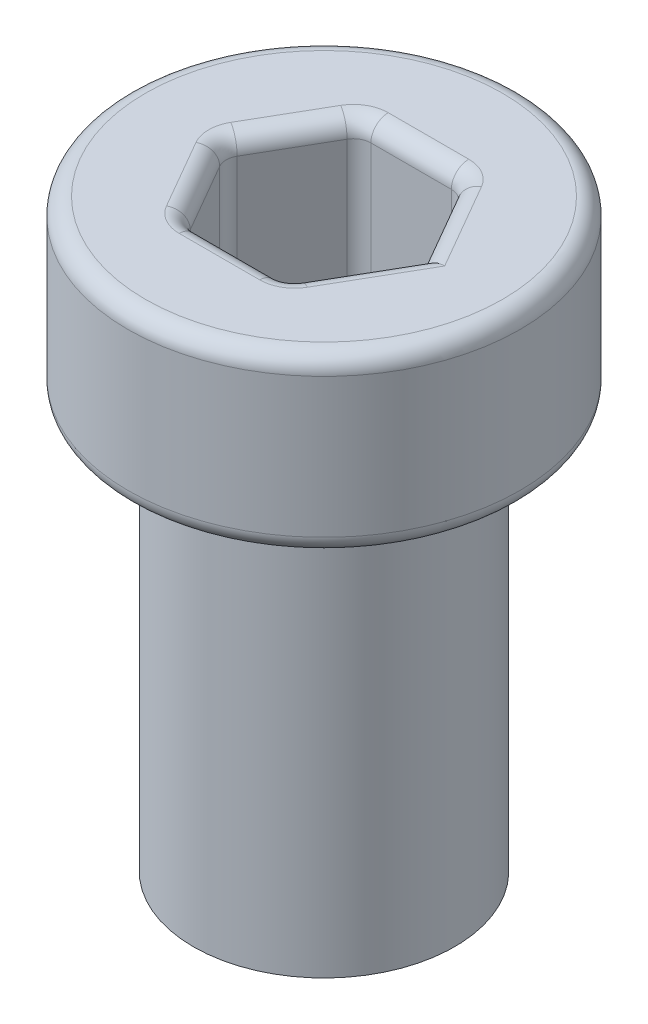
ISO-10303-21;
HEADER;
FILE_DESCRIPTION(('STEP AP214'),'2;1');
FILE_NAME('part.step','',(''),(''),'','','');
FILE_SCHEMA(('AUTOMOTIVE_DESIGN { 1 0 10303 214 1 1 1 1 }'));
ENDSEC;
DATA;
#1=APPLICATION_CONTEXT('core data for automotive mechanical design processes');
#2=APPLICATION_PROTOCOL_DEFINITION('international standard','automotive_design',2000,#1);
#3=PRODUCT_CONTEXT('',#1,'mechanical');
#4=PRODUCT('Part','Part','',(#3));
#5=PRODUCT_RELATED_PRODUCT_CATEGORY('part','',(#4));
#6=PRODUCT_DEFINITION_FORMATION('','',#4);
#7=PRODUCT_DEFINITION_CONTEXT('part definition',#1,'design');
#8=PRODUCT_DEFINITION('design','',#6,#7);
#9=PRODUCT_DEFINITION_SHAPE('','',#8);
#10=(LENGTH_UNIT() NAMED_UNIT(*) SI_UNIT(.MILLI.,.METRE.));
#11=(NAMED_UNIT(*) PLANE_ANGLE_UNIT() SI_UNIT($,.RADIAN.));
#12=(NAMED_UNIT(*) SI_UNIT($,.STERADIAN.) SOLID_ANGLE_UNIT());
#13=UNCERTAINTY_MEASURE_WITH_UNIT(LENGTH_MEASURE(1.E-05),#10,'distance_accuracy_value','');
#14=(GEOMETRIC_REPRESENTATION_CONTEXT(3) GLOBAL_UNCERTAINTY_ASSIGNED_CONTEXT((#13)) GLOBAL_UNIT_ASSIGNED_CONTEXT((#10,
#11,#12)) REPRESENTATION_CONTEXT('',''));
#15=CARTESIAN_POINT('',(0.,0.,0.));
#16=DIRECTION('',(0.,0.,1.));
#17=DIRECTION('',(1.,0.,0.));
#18=AXIS2_PLACEMENT_3D('',#15,#16,#17);
#19=CARTESIAN_POINT('',(0.,2.,0.));
#20=DIRECTION('',(0.,1.,0.));
#21=DIRECTION('',(0.,0.,1.));
#22=AXIS2_PLACEMENT_3D('',#19,#20,#21);
#23=PLANE('',#22);
#24=CARTESIAN_POINT('',(0.,2.,0.));
#25=DIRECTION('',(0.,1.,0.));
#26=DIRECTION('',(0.,0.,1.));
#27=AXIS2_PLACEMENT_3D('',#24,#25,#26);
#28=CIRCLE('',#27,2.05);
#29=CARTESIAN_POINT('',(0.,2.,2.05));
#30=VERTEX_POINT('',#29);
#31=EDGE_CURVE('E277',#30,#30,#28,.T.);
#32=ORIENTED_EDGE('',*,*,#31,.T.);
#33=EDGE_LOOP('',(#32));
#34=FACE_BOUND('',#33,.T.);
#35=CARTESIAN_POINT('',(0.4618802153517,2.,-0.8));
#36=DIRECTION('',(0.,1.,0.));
#37=DIRECTION('',(0.,0.,1.));
#38=AXIS2_PLACEMENT_3D('',#35,#36,#37);
#39=CIRCLE('',#38,0.4);
#40=CARTESIAN_POINT('',(0.808290376865476,2.,-1.));
#41=VERTEX_POINT('',#40);
#42=CARTESIAN_POINT('',(0.4618802153517,2.,-1.2));
#43=VERTEX_POINT('',#42);
#44=EDGE_CURVE('E58',#41,#43,#39,.T.);
#45=ORIENTED_EDGE('',*,*,#44,.F.);
#46=DIRECTION('',(-0.5,0.,-0.866025403784439));
#47=VECTOR('',#46,1.);
#48=CARTESIAN_POINT('',(1.03923048454133,2.,-0.6));
#49=LINE('',#48,#47);
#50=CARTESIAN_POINT('',(1.3856406460551,2.,0.));
#51=VERTEX_POINT('',#50);
#52=EDGE_CURVE('E302',#41,#51,#49,.F.);
#53=ORIENTED_EDGE('',*,*,#52,.T.);
#54=DIRECTION('',(0.5,0.,-0.866025403784439));
#55=VECTOR('',#54,1.);
#56=CARTESIAN_POINT('',(1.03923048454133,2.,0.6));
#57=LINE('',#56,#55);
#58=CARTESIAN_POINT('',(0.808290376865476,2.,1.));
#59=VERTEX_POINT('',#58);
#60=EDGE_CURVE('E300',#51,#59,#57,.F.);
#61=ORIENTED_EDGE('',*,*,#60,.T.);
#62=CARTESIAN_POINT('',(0.461880215351701,2.,0.8));
#63=DIRECTION('',(0.,1.,0.));
#64=DIRECTION('',(0.,0.,1.));
#65=AXIS2_PLACEMENT_3D('',#62,#63,#64);
#66=CIRCLE('',#65,0.4);
#67=CARTESIAN_POINT('',(0.461880215351701,2.,1.2));
#68=VERTEX_POINT('',#67);
#69=EDGE_CURVE('E297',#68,#59,#66,.T.);
#70=ORIENTED_EDGE('',*,*,#69,.F.);
#71=DIRECTION('',(1.,0.,0.));
#72=VECTOR('',#71,1.);
#73=CARTESIAN_POINT('',(0.,2.,1.2));
#74=LINE('',#73,#72);
#75=CARTESIAN_POINT('',(-0.4618802153517,2.,1.2));
#76=VERTEX_POINT('',#75);
#77=EDGE_CURVE('E293',#68,#76,#74,.F.);
#78=ORIENTED_EDGE('',*,*,#77,.T.);
#79=CARTESIAN_POINT('',(-0.4618802153517,2.,0.8));
#80=DIRECTION('',(0.,1.,0.));
#81=DIRECTION('',(0.,0.,1.));
#82=AXIS2_PLACEMENT_3D('',#79,#80,#81);
#83=CIRCLE('',#82,0.4);
#84=CARTESIAN_POINT('',(-0.808290376865476,2.,1.));
#85=VERTEX_POINT('',#84);
#86=EDGE_CURVE('E290',#85,#76,#83,.T.);
#87=ORIENTED_EDGE('',*,*,#86,.F.);
#88=DIRECTION('',(0.5,0.,0.866025403784438));
#89=VECTOR('',#88,1.);
#90=CARTESIAN_POINT('',(-1.03923048454133,2.,0.6));
#91=LINE('',#90,#89);
#92=CARTESIAN_POINT('',(-1.27017059221718,2.,0.2));
#93=VERTEX_POINT('',#92);
#94=EDGE_CURVE('E288',#85,#93,#91,.F.);
#95=ORIENTED_EDGE('',*,*,#94,.T.);
#96=CARTESIAN_POINT('',(-0.923760430703401,2.,0.));
#97=DIRECTION('',(0.,1.,0.));
#98=DIRECTION('',(0.,0.,1.));
#99=AXIS2_PLACEMENT_3D('',#96,#97,#98);
#100=CIRCLE('',#99,0.4);
#101=CARTESIAN_POINT('',(-1.27017059221718,2.,-0.199999999999999));
#102=VERTEX_POINT('',#101);
#103=EDGE_CURVE('E285',#102,#93,#100,.T.);
#104=ORIENTED_EDGE('',*,*,#103,.F.);
#105=DIRECTION('',(-0.5,0.,0.866025403784439));
#106=VECTOR('',#105,1.);
#107=CARTESIAN_POINT('',(-1.03923048454133,2.,-0.599999999999999));
#108=LINE('',#107,#106);
#109=CARTESIAN_POINT('',(-0.808290376865476,2.,-1.));
#110=VERTEX_POINT('',#109);
#111=EDGE_CURVE('E283',#102,#110,#108,.F.);
#112=ORIENTED_EDGE('',*,*,#111,.T.);
#113=CARTESIAN_POINT('',(-0.461880215351701,2.,-0.8));
#114=DIRECTION('',(0.,1.,0.));
#115=DIRECTION('',(0.,0.,1.));
#116=AXIS2_PLACEMENT_3D('',#113,#114,#115);
#117=CIRCLE('',#116,0.4);
#118=CARTESIAN_POINT('',(-0.461880215351701,2.,-1.2));
#119=VERTEX_POINT('',#118);
#120=EDGE_CURVE('E280',#119,#110,#117,.T.);
#121=ORIENTED_EDGE('',*,*,#120,.F.);
#122=DIRECTION('',(-1.,0.,0.));
#123=VECTOR('',#122,1.);
#124=CARTESIAN_POINT('',(0.,2.,-1.2));
#125=LINE('',#124,#123);
#126=EDGE_CURVE('E295',#119,#43,#125,.F.);
#127=ORIENTED_EDGE('',*,*,#126,.T.);
#128=EDGE_LOOP('',(#45,#53,#61,#70,#78,#87,#95,#104,#112,#121,#127));
#129=FACE_BOUND('',#128,.T.);
#130=ADVANCED_FACE('F41',(#34,#129),#23,.T.);
#131=CARTESIAN_POINT('',(0.,0.,0.));
#132=DIRECTION('',(0.,1.,0.));
#133=DIRECTION('',(0.,0.,1.));
#134=AXIS2_PLACEMENT_3D('',#131,#132,#133);
#135=PLANE('',#134);
#136=CARTESIAN_POINT('',(0.,0.,0.));
#137=DIRECTION('',(0.,1.,0.));
#138=DIRECTION('',(0.,0.,1.));
#139=AXIS2_PLACEMENT_3D('',#136,#137,#138);
#140=CIRCLE('',#139,2.05);
#141=CARTESIAN_POINT('',(0.,0.,2.05));
#142=VERTEX_POINT('',#141);
#143=EDGE_CURVE('E11',#142,#142,#140,.F.);
#144=ORIENTED_EDGE('',*,*,#143,.T.);
#145=EDGE_LOOP('',(#144));
#146=FACE_BOUND('',#145,.T.);
#147=CARTESIAN_POINT('',(0.,0.,0.));
#148=DIRECTION('',(0.,1.,0.));
#149=DIRECTION('',(0.,0.,1.));
#150=AXIS2_PLACEMENT_3D('',#147,#148,#149);
#151=CIRCLE('',#150,1.5);
#152=CARTESIAN_POINT('',(0.,0.,1.5));
#153=VERTEX_POINT('',#152);
#154=EDGE_CURVE('E384',#153,#153,#151,.T.);
#155=ORIENTED_EDGE('',*,*,#154,.T.);
#156=EDGE_LOOP('',(#155));
#157=FACE_BOUND('',#156,.T.);
#158=ADVANCED_FACE('F419',(#146,#157),#135,.F.);
#159=CARTESIAN_POINT('',(0.,2.,0.));
#160=DIRECTION('',(0.,-1.,0.));
#161=DIRECTION('',(0.,0.,-1.));
#162=AXIS2_PLACEMENT_3D('',#159,#160,#161);
#163=CYLINDRICAL_SURFACE('',#162,2.25);
#164=CARTESIAN_POINT('',(0.,0.2,0.));
#165=DIRECTION('',(0.,1.,0.));
#166=DIRECTION('',(0.,0.,1.));
#167=AXIS2_PLACEMENT_3D('',#164,#165,#166);
#168=CIRCLE('',#167,2.25);
#169=CARTESIAN_POINT('',(0.,0.2,2.25));
#170=VERTEX_POINT('',#169);
#171=EDGE_CURVE('E50',#170,#170,#168,.T.);
#172=ORIENTED_EDGE('',*,*,#171,.T.);
#173=EDGE_LOOP('',(#172));
#174=FACE_BOUND('',#173,.T.);
#175=CARTESIAN_POINT('',(0.,1.8,0.));
#176=DIRECTION('',(0.,1.,0.));
#177=DIRECTION('',(0.,0.,1.));
#178=AXIS2_PLACEMENT_3D('',#175,#176,#177);
#179=CIRCLE('',#178,2.25);
#180=CARTESIAN_POINT('',(0.,1.8,2.25));
#181=VERTEX_POINT('',#180);
#182=EDGE_CURVE('E305',#181,#181,#179,.F.);
#183=ORIENTED_EDGE('',*,*,#182,.T.);
#184=EDGE_LOOP('',(#183));
#185=FACE_BOUND('',#184,.T.);
#186=ADVANCED_FACE('F425',(#174,#185),#163,.T.);
#187=CARTESIAN_POINT('',(0.577350269189626,2.,-1.));
#188=DIRECTION('',(0.,0.,1.));
#189=DIRECTION('',(1.,0.,0.));
#190=AXIS2_PLACEMENT_3D('',#187,#188,#189);
#191=PLANE('',#190);
#192=DIRECTION('',(0.,-1.,0.));
#193=VECTOR('',#192,1.);
#194=CARTESIAN_POINT('',(-0.461880215351701,0.,-1.));
#195=LINE('',#194,#193);
#196=CARTESIAN_POINT('',(-0.461880215351701,1.8,-1.));
#197=VERTEX_POINT('',#196);
#198=CARTESIAN_POINT('',(-0.461880215351701,0.2,-1.));
#199=VERTEX_POINT('',#198);
#200=EDGE_CURVE('E190',#197,#199,#195,.T.);
#201=ORIENTED_EDGE('',*,*,#200,.T.);
#202=DIRECTION('',(-1.,0.,0.));
#203=VECTOR('',#202,1.);
#204=CARTESIAN_POINT('',(0.577350269189626,0.2,-1.));
#205=LINE('',#204,#203);
#206=CARTESIAN_POINT('',(0.4618802153517,0.2,-1.));
#207=VERTEX_POINT('',#206);
#208=EDGE_CURVE('E186',#199,#207,#205,.F.);
#209=ORIENTED_EDGE('',*,*,#208,.T.);
#210=DIRECTION('',(0.,-1.,0.));
#211=VECTOR('',#210,1.);
#212=CARTESIAN_POINT('',(0.4618802153517,2.,-1.));
#213=LINE('',#212,#211);
#214=CARTESIAN_POINT('',(0.4618802153517,1.8,-1.));
#215=VERTEX_POINT('',#214);
#216=EDGE_CURVE('E178',#207,#215,#213,.F.);
#217=ORIENTED_EDGE('',*,*,#216,.T.);
#218=DIRECTION('',(-1.,0.,0.));
#219=VECTOR('',#218,1.);
#220=CARTESIAN_POINT('',(0.577350269189626,1.8,-1.));
#221=LINE('',#220,#219);
#222=EDGE_CURVE('E183',#215,#197,#221,.T.);
#223=ORIENTED_EDGE('',*,*,#222,.T.);
#224=EDGE_LOOP('',(#201,#209,#217,#223));
#225=FACE_BOUND('',#224,.T.);
#226=ADVANCED_FACE('F181',(#225),#191,.T.);
#227=CARTESIAN_POINT('',(-0.577350269189626,2.,-1.));
#228=DIRECTION('',(0.866025403784439,0.,0.5));
#229=DIRECTION('',(0.5,0.,-0.866025403784439));
#230=AXIS2_PLACEMENT_3D('',#227,#228,#229);
#231=PLANE('',#230);
#232=DIRECTION('',(0.,-1.,0.));
#233=VECTOR('',#232,1.);
#234=CARTESIAN_POINT('',(-1.09696551146029,0.,-0.0999999999999996));
#235=LINE('',#234,#233);
#236=CARTESIAN_POINT('',(-1.09696551146029,1.8,-0.0999999999999995));
#237=VERTEX_POINT('',#236);
#238=CARTESIAN_POINT('',(-1.09696551146029,0.2,-0.0999999999999996));
#239=VERTEX_POINT('',#238);
#240=EDGE_CURVE('E227',#237,#239,#235,.T.);
#241=ORIENTED_EDGE('',*,*,#240,.T.);
#242=DIRECTION('',(-0.5,0.,0.866025403784439));
#243=VECTOR('',#242,1.);
#244=CARTESIAN_POINT('',(-0.577350269189626,0.2,-1.));
#245=LINE('',#244,#243);
#246=CARTESIAN_POINT('',(-0.635085296108588,0.2,-0.9));
#247=VERTEX_POINT('',#246);
#248=EDGE_CURVE('E232',#239,#247,#245,.F.);
#249=ORIENTED_EDGE('',*,*,#248,.T.);
#250=DIRECTION('',(0.,-1.,0.));
#251=VECTOR('',#250,1.);
#252=CARTESIAN_POINT('',(-0.635085296108588,2.,-0.9));
#253=LINE('',#252,#251);
#254=CARTESIAN_POINT('',(-0.635085296108588,1.8,-0.9));
#255=VERTEX_POINT('',#254);
#256=EDGE_CURVE('E229',#247,#255,#253,.F.);
#257=ORIENTED_EDGE('',*,*,#256,.T.);
#258=DIRECTION('',(-0.5,0.,0.866025403784439));
#259=VECTOR('',#258,1.);
#260=CARTESIAN_POINT('',(-0.577350269189626,1.8,-1.));
#261=LINE('',#260,#259);
#262=EDGE_CURVE('E225',#255,#237,#261,.T.);
#263=ORIENTED_EDGE('',*,*,#262,.T.);
#264=EDGE_LOOP('',(#241,#249,#257,#263));
#265=FACE_BOUND('',#264,.T.);
#266=ADVANCED_FACE('F435',(#265),#231,.T.);
#267=CARTESIAN_POINT('',(-1.15470053837925,2.,0.));
#268=DIRECTION('',(0.866025403784439,0.,-0.5));
#269=DIRECTION('',(-0.5,0.,-0.866025403784438));
#270=AXIS2_PLACEMENT_3D('',#267,#268,#269);
#271=PLANE('',#270);
#272=DIRECTION('',(0.,-1.,0.));
#273=VECTOR('',#272,1.);
#274=CARTESIAN_POINT('',(-0.635085296108588,0.,0.9));
#275=LINE('',#274,#273);
#276=CARTESIAN_POINT('',(-0.635085296108588,1.8,0.9));
#277=VERTEX_POINT('',#276);
#278=CARTESIAN_POINT('',(-0.635085296108588,0.2,0.9));
#279=VERTEX_POINT('',#278);
#280=EDGE_CURVE('E236',#277,#279,#275,.T.);
#281=ORIENTED_EDGE('',*,*,#280,.T.);
#282=DIRECTION('',(0.5,0.,0.866025403784438));
#283=VECTOR('',#282,1.);
#284=CARTESIAN_POINT('',(-1.15470053837925,0.2,0.));
#285=LINE('',#284,#283);
#286=CARTESIAN_POINT('',(-1.09696551146029,0.2,0.1));
#287=VERTEX_POINT('',#286);
#288=EDGE_CURVE('E241',#279,#287,#285,.F.);
#289=ORIENTED_EDGE('',*,*,#288,.T.);
#290=DIRECTION('',(0.,-1.,0.));
#291=VECTOR('',#290,1.);
#292=CARTESIAN_POINT('',(-1.09696551146029,2.,0.1));
#293=LINE('',#292,#291);
#294=CARTESIAN_POINT('',(-1.09696551146029,1.8,0.1));
#295=VERTEX_POINT('',#294);
#296=EDGE_CURVE('E238',#287,#295,#293,.F.);
#297=ORIENTED_EDGE('',*,*,#296,.T.);
#298=DIRECTION('',(0.5,0.,0.866025403784438));
#299=VECTOR('',#298,1.);
#300=CARTESIAN_POINT('',(-1.15470053837925,1.8,0.));
#301=LINE('',#300,#299);
#302=EDGE_CURVE('E234',#295,#277,#301,.T.);
#303=ORIENTED_EDGE('',*,*,#302,.T.);
#304=EDGE_LOOP('',(#281,#289,#297,#303));
#305=FACE_BOUND('',#304,.T.);
#306=ADVANCED_FACE('F606',(#305),#271,.T.);
#307=CARTESIAN_POINT('',(-0.577350269189625,2.,1.));
#308=DIRECTION('',(0.,0.,-1.));
#309=DIRECTION('',(-1.,0.,0.));
#310=AXIS2_PLACEMENT_3D('',#307,#308,#309);
#311=PLANE('',#310);
#312=DIRECTION('',(0.,-1.,0.));
#313=VECTOR('',#312,1.);
#314=CARTESIAN_POINT('',(0.461880215351701,0.,1.));
#315=LINE('',#314,#313);
#316=CARTESIAN_POINT('',(0.461880215351701,1.8,1.));
#317=VERTEX_POINT('',#316);
#318=CARTESIAN_POINT('',(0.461880215351701,0.2,1.));
#319=VERTEX_POINT('',#318);
#320=EDGE_CURVE('E245',#317,#319,#315,.T.);
#321=ORIENTED_EDGE('',*,*,#320,.T.);
#322=DIRECTION('',(1.,0.,0.));
#323=VECTOR('',#322,1.);
#324=CARTESIAN_POINT('',(-0.577350269189625,0.2,1.));
#325=LINE('',#324,#323);
#326=CARTESIAN_POINT('',(-0.4618802153517,0.2,1.));
#327=VERTEX_POINT('',#326);
#328=EDGE_CURVE('E250',#319,#327,#325,.F.);
#329=ORIENTED_EDGE('',*,*,#328,.T.);
#330=DIRECTION('',(0.,-1.,0.));
#331=VECTOR('',#330,1.);
#332=CARTESIAN_POINT('',(-0.4618802153517,2.,1.));
#333=LINE('',#332,#331);
#334=CARTESIAN_POINT('',(-0.4618802153517,1.8,1.));
#335=VERTEX_POINT('',#334);
#336=EDGE_CURVE('E247',#327,#335,#333,.F.);
#337=ORIENTED_EDGE('',*,*,#336,.T.);
#338=DIRECTION('',(1.,0.,0.));
#339=VECTOR('',#338,1.);
#340=CARTESIAN_POINT('',(-0.577350269189625,1.8,1.));
#341=LINE('',#340,#339);
#342=EDGE_CURVE('E243',#335,#317,#341,.T.);
#343=ORIENTED_EDGE('',*,*,#342,.T.);
#344=EDGE_LOOP('',(#321,#329,#337,#343));
#345=FACE_BOUND('',#344,.T.);
#346=ADVANCED_FACE('F604',(#345),#311,.T.);
#347=CARTESIAN_POINT('',(0.577350269189626,2.,1.));
#348=DIRECTION('',(-0.866025403784439,0.,-0.5));
#349=DIRECTION('',(-0.5,0.,0.866025403784439));
#350=AXIS2_PLACEMENT_3D('',#347,#348,#349);
#351=PLANE('',#350);
#352=DIRECTION('',(0.,-1.,0.));
#353=VECTOR('',#352,1.);
#354=CARTESIAN_POINT('',(1.15470053837925,2.,0.));
#355=LINE('',#354,#353);
#356=CARTESIAN_POINT('',(1.15470053837925,1.8,0.));
#357=VERTEX_POINT('',#356);
#358=CARTESIAN_POINT('',(1.15470053837925,0.2,0.));
#359=VERTEX_POINT('',#358);
#360=EDGE_CURVE('E387',#357,#359,#355,.T.);
#361=ORIENTED_EDGE('',*,*,#360,.T.);
#362=DIRECTION('',(0.5,0.,-0.866025403784439));
#363=VECTOR('',#362,1.);
#364=CARTESIAN_POINT('',(0.577350269189626,0.2,1.));
#365=LINE('',#364,#363);
#366=CARTESIAN_POINT('',(0.635085296108589,0.2,0.9));
#367=VERTEX_POINT('',#366);
#368=EDGE_CURVE('E257',#359,#367,#365,.F.);
#369=ORIENTED_EDGE('',*,*,#368,.T.);
#370=DIRECTION('',(0.,-1.,0.));
#371=VECTOR('',#370,1.);
#372=CARTESIAN_POINT('',(0.635085296108588,2.,0.9));
#373=LINE('',#372,#371);
#374=CARTESIAN_POINT('',(0.635085296108589,1.8,0.9));
#375=VERTEX_POINT('',#374);
#376=EDGE_CURVE('E254',#367,#375,#373,.F.);
#377=ORIENTED_EDGE('',*,*,#376,.T.);
#378=DIRECTION('',(0.5,0.,-0.866025403784439));
#379=VECTOR('',#378,1.);
#380=CARTESIAN_POINT('',(0.577350269189626,1.8,1.));
#381=LINE('',#380,#379);
#382=EDGE_CURVE('E252',#375,#357,#381,.T.);
#383=ORIENTED_EDGE('',*,*,#382,.T.);
#384=EDGE_LOOP('',(#361,#369,#377,#383));
#385=FACE_BOUND('',#384,.T.);
#386=ADVANCED_FACE('F570',(#385),#351,.T.);
#387=CARTESIAN_POINT('',(1.15470053837925,2.,0.));
#388=DIRECTION('',(-0.866025403784439,0.,0.5));
#389=DIRECTION('',(0.5,0.,0.866025403784439));
#390=AXIS2_PLACEMENT_3D('',#387,#388,#389);
#391=PLANE('',#390);
#392=DIRECTION('',(0.,-1.,0.));
#393=VECTOR('',#392,1.);
#394=CARTESIAN_POINT('',(0.635085296108588,0.,-0.9));
#395=LINE('',#394,#393);
#396=CARTESIAN_POINT('',(0.635085296108588,1.8,-0.9));
#397=VERTEX_POINT('',#396);
#398=CARTESIAN_POINT('',(0.635085296108588,0.2,-0.9));
#399=VERTEX_POINT('',#398);
#400=EDGE_CURVE('E197',#397,#399,#395,.T.);
#401=ORIENTED_EDGE('',*,*,#400,.T.);
#402=DIRECTION('',(-0.5,0.,-0.866025403784439));
#403=VECTOR('',#402,1.);
#404=CARTESIAN_POINT('',(1.15470053837925,0.2,0.));
#405=LINE('',#404,#403);
#406=EDGE_CURVE('E262',#399,#359,#405,.F.);
#407=ORIENTED_EDGE('',*,*,#406,.T.);
#408=ORIENTED_EDGE('',*,*,#360,.F.);
#409=DIRECTION('',(-0.5,0.,-0.866025403784439));
#410=VECTOR('',#409,1.);
#411=CARTESIAN_POINT('',(1.15470053837925,1.8,0.));
#412=LINE('',#411,#410);
#413=EDGE_CURVE('E259',#357,#397,#412,.T.);
#414=ORIENTED_EDGE('',*,*,#413,.T.);
#415=EDGE_LOOP('',(#401,#407,#408,#414));
#416=FACE_BOUND('',#415,.T.);
#417=ADVANCED_FACE('F567',(#416),#391,.T.);
#418=CARTESIAN_POINT('',(0.,0.,0.));
#419=DIRECTION('',(0.,1.,0.));
#420=DIRECTION('',(0.,0.,1.));
#421=AXIS2_PLACEMENT_3D('',#418,#419,#420);
#422=PLANE('',#421);
#423=DIRECTION('',(-0.5,0.,-0.866025403784439));
#424=VECTOR('',#423,1.);
#425=CARTESIAN_POINT('',(0.404145188432738,0.,-0.9));
#426=LINE('',#425,#424);
#427=CARTESIAN_POINT('',(0.923760430703401,0.,0.));
#428=VERTEX_POINT('',#427);
#429=CARTESIAN_POINT('',(0.461880215351701,0.,-0.8));
#430=VERTEX_POINT('',#429);
#431=EDGE_CURVE('E272',#428,#430,#426,.T.);
#432=ORIENTED_EDGE('',*,*,#431,.T.);
#433=DIRECTION('',(-1.,0.,0.));
#434=VECTOR('',#433,1.);
#435=CARTESIAN_POINT('',(-0.577350269189626,0.,-0.8));
#436=LINE('',#435,#434);
#437=CARTESIAN_POINT('',(-0.461880215351701,0.,-0.8));
#438=VERTEX_POINT('',#437);
#439=EDGE_CURVE('E274',#430,#438,#436,.T.);
#440=ORIENTED_EDGE('',*,*,#439,.T.);
#441=DIRECTION('',(-0.5,0.,0.866025403784439));
#442=VECTOR('',#441,1.);
#443=CARTESIAN_POINT('',(-0.981495457622363,0.,0.1));
#444=LINE('',#443,#442);
#445=CARTESIAN_POINT('',(-0.923760430703401,0.,0.));
#446=VERTEX_POINT('',#445);
#447=EDGE_CURVE('E270',#438,#446,#444,.T.);
#448=ORIENTED_EDGE('',*,*,#447,.T.);
#449=DIRECTION('',(0.5,0.,0.866025403784438));
#450=VECTOR('',#449,1.);
#451=CARTESIAN_POINT('',(-0.404145188432738,0.,0.9));
#452=LINE('',#451,#450);
#453=CARTESIAN_POINT('',(-0.4618802153517,0.,0.8));
#454=VERTEX_POINT('',#453);
#455=EDGE_CURVE('E268',#446,#454,#452,.T.);
#456=ORIENTED_EDGE('',*,*,#455,.T.);
#457=DIRECTION('',(1.,0.,0.));
#458=VECTOR('',#457,1.);
#459=CARTESIAN_POINT('',(0.577350269189626,0.,0.8));
#460=LINE('',#459,#458);
#461=CARTESIAN_POINT('',(0.461880215351701,0.,0.8));
#462=VERTEX_POINT('',#461);
#463=EDGE_CURVE('E264',#454,#462,#460,.T.);
#464=ORIENTED_EDGE('',*,*,#463,.T.);
#465=DIRECTION('',(0.5,0.,-0.866025403784439));
#466=VECTOR('',#465,1.);
#467=CARTESIAN_POINT('',(0.981495457622364,0.,-0.1));
#468=LINE('',#467,#466);
#469=EDGE_CURVE('E266',#462,#428,#468,.T.);
#470=ORIENTED_EDGE('',*,*,#469,.T.);
#471=EDGE_LOOP('',(#432,#440,#448,#456,#464,#470));
#472=FACE_BOUND('',#471,.T.);
#473=ADVANCED_FACE('F558',(#472),#422,.T.);
#474=CARTESIAN_POINT('',(0.,-5.,0.));
#475=DIRECTION('',(0.,1.,0.));
#476=DIRECTION('',(0.,0.,1.));
#477=AXIS2_PLACEMENT_3D('',#474,#475,#476);
#478=CYLINDRICAL_SURFACE('',#477,1.5);
#479=CARTESIAN_POINT('',(0.,-4.71132486540519,0.));
#480=DIRECTION('',(0.,1.,0.));
#481=DIRECTION('',(0.,0.,1.));
#482=AXIS2_PLACEMENT_3D('',#479,#480,#481);
#483=CIRCLE('',#482,1.5);
#484=CARTESIAN_POINT('',(0.,-4.71132486540519,1.5));
#485=VERTEX_POINT('',#484);
#486=EDGE_CURVE('E219',#485,#485,#483,.T.);
#487=ORIENTED_EDGE('',*,*,#486,.T.);
#488=EDGE_LOOP('',(#487));
#489=FACE_BOUND('',#488,.T.);
#490=ORIENTED_EDGE('',*,*,#154,.F.);
#491=EDGE_LOOP('',(#490));
#492=FACE_BOUND('',#491,.T.);
#493=ADVANCED_FACE('F396',(#489,#492),#478,.T.);
#494=CARTESIAN_POINT('',(0.,-5.,0.));
#495=DIRECTION('',(0.,1.,0.));
#496=DIRECTION('',(0.,0.,1.));
#497=AXIS2_PLACEMENT_3D('',#494,#495,#496);
#498=PLANE('',#497);
#499=CARTESIAN_POINT('',(0.,-5.,0.));
#500=DIRECTION('',(0.,1.,0.));
#501=DIRECTION('',(0.,0.,1.));
#502=AXIS2_PLACEMENT_3D('',#499,#500,#501);
#503=CIRCLE('',#502,0.999999999999998);
#504=CARTESIAN_POINT('',(0.,-5.,0.999999999999998));
#505=VERTEX_POINT('',#504);
#506=EDGE_CURVE('E216',#505,#505,#503,.F.);
#507=ORIENTED_EDGE('',*,*,#506,.T.);
#508=EDGE_LOOP('',(#507));
#509=FACE_BOUND('',#508,.T.);
#510=ADVANCED_FACE('F402',(#509),#498,.F.);
#511=CARTESIAN_POINT('',(0.,-4.71132486540519,0.));
#512=DIRECTION('',(0.,1.,0.));
#513=DIRECTION('',(0.,0.,1.));
#514=AXIS2_PLACEMENT_3D('',#511,#512,#513);
#515=CONICAL_SURFACE('',#514,1.5,1.0471975511966);
#516=ORIENTED_EDGE('',*,*,#506,.F.);
#517=EDGE_LOOP('',(#516));
#518=FACE_BOUND('',#517,.T.);
#519=ORIENTED_EDGE('',*,*,#486,.F.);
#520=EDGE_LOOP('',(#519));
#521=FACE_BOUND('',#520,.T.);
#522=ADVANCED_FACE('F399',(#518,#521),#515,.T.);
#523=CARTESIAN_POINT('',(0.461880215351701,2.,0.8));
#524=DIRECTION('',(0.,1.,0.));
#525=DIRECTION('',(0.,0.,1.));
#526=AXIS2_PLACEMENT_3D('',#523,#524,#525);
#527=CYLINDRICAL_SURFACE('',#526,0.2);
#528=CARTESIAN_POINT('',(0.461880215351701,0.2,0.8));
#529=DIRECTION('',(0.,1.,0.));
#530=DIRECTION('',(0.,0.,1.));
#531=AXIS2_PLACEMENT_3D('',#528,#529,#530);
#532=CIRCLE('',#531,0.2);
#533=EDGE_CURVE('E376',#319,#367,#532,.T.);
#534=ORIENTED_EDGE('',*,*,#533,.F.);
#535=ORIENTED_EDGE('',*,*,#320,.F.);
#536=CARTESIAN_POINT('',(0.461880215351701,1.8,0.8));
#537=DIRECTION('',(0.,1.,0.));
#538=DIRECTION('',(0.,0.,1.));
#539=AXIS2_PLACEMENT_3D('',#536,#537,#538);
#540=CIRCLE('',#539,0.2);
#541=EDGE_CURVE('E378',#375,#317,#540,.F.);
#542=ORIENTED_EDGE('',*,*,#541,.F.);
#543=ORIENTED_EDGE('',*,*,#376,.F.);
#544=EDGE_LOOP('',(#534,#535,#542,#543));
#545=FACE_BOUND('',#544,.T.);
#546=ADVANCED_FACE('F401',(#545),#527,.F.);
#547=CARTESIAN_POINT('',(-0.577350269189625,1.8,1.2));
#548=DIRECTION('',(1.,0.,0.));
#549=DIRECTION('',(0.,0.,-1.));
#550=AXIS2_PLACEMENT_3D('',#547,#548,#549);
#551=CYLINDRICAL_SURFACE('',#550,0.2);
#552=CARTESIAN_POINT('',(-0.4618802153517,1.8,1.2));
#553=DIRECTION('',(-1.,0.,0.));
#554=DIRECTION('',(0.,0.,1.));
#555=AXIS2_PLACEMENT_3D('',#552,#553,#554);
#556=CIRCLE('',#555,0.2);
#557=EDGE_CURVE('E368',#76,#335,#556,.T.);
#558=ORIENTED_EDGE('',*,*,#557,.F.);
#559=ORIENTED_EDGE('',*,*,#77,.F.);
#560=CARTESIAN_POINT('',(0.461880215351701,1.8,1.2));
#561=DIRECTION('',(1.,0.,0.));
#562=DIRECTION('',(0.,0.,-1.));
#563=AXIS2_PLACEMENT_3D('',#560,#561,#562);
#564=CIRCLE('',#563,0.2);
#565=EDGE_CURVE('E45',#317,#68,#564,.T.);
#566=ORIENTED_EDGE('',*,*,#565,.F.);
#567=ORIENTED_EDGE('',*,*,#342,.F.);
#568=EDGE_LOOP('',(#558,#559,#566,#567));
#569=FACE_BOUND('',#568,.T.);
#570=ADVANCED_FACE('F409',(#569),#551,.T.);
#571=CARTESIAN_POINT('',(0.461880215351701,1.8,0.8));
#572=DIRECTION('',(0.,1.,0.));
#573=DIRECTION('',(0.,0.,1.));
#574=AXIS2_PLACEMENT_3D('',#571,#572,#573);
#575=TOROIDAL_SURFACE('',#574,0.4,0.2);
#576=ORIENTED_EDGE('',*,*,#565,.T.);
#577=ORIENTED_EDGE('',*,*,#69,.T.);
#578=CARTESIAN_POINT('',(0.808290376865476,1.8,1.));
#579=DIRECTION('',(-0.5,0.,0.866025403784438));
#580=DIRECTION('',(0.866025403784439,0.,0.5));
#581=AXIS2_PLACEMENT_3D('',#578,#579,#580);
#582=CIRCLE('',#581,0.2);
#583=EDGE_CURVE('E365',#375,#59,#582,.F.);
#584=ORIENTED_EDGE('',*,*,#583,.F.);
#585=ORIENTED_EDGE('',*,*,#541,.T.);
#586=EDGE_LOOP('',(#576,#577,#584,#585));
#587=FACE_BOUND('',#586,.T.);
#588=ADVANCED_FACE('F459',(#587),#575,.T.);
#589=CARTESIAN_POINT('',(0.461880215351701,0.2,0.8));
#590=DIRECTION('',(0.,0.,1.));
#591=DIRECTION('',(1.,0.,0.));
#592=AXIS2_PLACEMENT_3D('',#589,#590,#591);
#593=SPHERICAL_SURFACE('',#592,0.2);
#594=CARTESIAN_POINT('',(0.461880215351701,0.2,0.8));
#595=DIRECTION('',(0.5,0.,-0.866025403784439));
#596=DIRECTION('',(-0.866025403784439,0.,-0.5));
#597=AXIS2_PLACEMENT_3D('',#594,#595,#596);
#598=CIRCLE('',#597,0.2);
#599=EDGE_CURVE('E362',#462,#367,#598,.F.);
#600=ORIENTED_EDGE('',*,*,#599,.F.);
#601=CARTESIAN_POINT('',(0.461880215351701,0.2,0.8));
#602=DIRECTION('',(-1.,0.,0.));
#603=DIRECTION('',(0.,0.,1.));
#604=AXIS2_PLACEMENT_3D('',#601,#602,#603);
#605=CIRCLE('',#604,0.2);
#606=EDGE_CURVE('E373',#319,#462,#605,.F.);
#607=ORIENTED_EDGE('',*,*,#606,.F.);
#608=ORIENTED_EDGE('',*,*,#533,.T.);
#609=EDGE_LOOP('',(#600,#607,#608));
#610=FACE_BOUND('',#609,.T.);
#611=ADVANCED_FACE('F463',(#610),#593,.F.);
#612=CARTESIAN_POINT('',(0.,0.2,0.8));
#613=DIRECTION('',(-1.,0.,0.));
#614=DIRECTION('',(0.,0.,1.));
#615=AXIS2_PLACEMENT_3D('',#612,#613,#614);
#616=CYLINDRICAL_SURFACE('',#615,0.2);
#617=ORIENTED_EDGE('',*,*,#606,.T.);
#618=ORIENTED_EDGE('',*,*,#463,.F.);
#619=CARTESIAN_POINT('',(-0.4618802153517,0.2,0.8));
#620=DIRECTION('',(1.,0.,0.));
#621=DIRECTION('',(0.,0.,-1.));
#622=AXIS2_PLACEMENT_3D('',#619,#620,#621);
#623=CIRCLE('',#622,0.2);
#624=EDGE_CURVE('E359',#327,#454,#623,.T.);
#625=ORIENTED_EDGE('',*,*,#624,.F.);
#626=ORIENTED_EDGE('',*,*,#328,.F.);
#627=EDGE_LOOP('',(#617,#618,#625,#626));
#628=FACE_BOUND('',#627,.T.);
#629=ADVANCED_FACE('F466',(#628),#616,.F.);
#630=CARTESIAN_POINT('',(-0.4618802153517,2.,0.8));
#631=DIRECTION('',(0.,1.,0.));
#632=DIRECTION('',(0.,0.,1.));
#633=AXIS2_PLACEMENT_3D('',#630,#631,#632);
#634=CYLINDRICAL_SURFACE('',#633,0.2);
#635=CARTESIAN_POINT('',(-0.4618802153517,1.8,0.8));
#636=DIRECTION('',(0.,1.,0.));
#637=DIRECTION('',(0.,0.,1.));
#638=AXIS2_PLACEMENT_3D('',#635,#636,#637);
#639=CIRCLE('',#638,0.2);
#640=EDGE_CURVE('E370',#335,#277,#639,.F.);
#641=ORIENTED_EDGE('',*,*,#640,.F.);
#642=ORIENTED_EDGE('',*,*,#336,.F.);
#643=CARTESIAN_POINT('',(-0.4618802153517,0.2,0.8));
#644=DIRECTION('',(0.,1.,0.));
#645=DIRECTION('',(0.,0.,1.));
#646=AXIS2_PLACEMENT_3D('',#643,#644,#645);
#647=CIRCLE('',#646,0.2);
#648=EDGE_CURVE('E356',#279,#327,#647,.T.);
#649=ORIENTED_EDGE('',*,*,#648,.F.);
#650=ORIENTED_EDGE('',*,*,#280,.F.);
#651=EDGE_LOOP('',(#641,#642,#649,#650));
#652=FACE_BOUND('',#651,.T.);
#653=ADVANCED_FACE('F470',(#652),#634,.F.);
#654=CARTESIAN_POINT('',(-0.4618802153517,1.8,0.8));
#655=DIRECTION('',(0.,1.,0.));
#656=DIRECTION('',(0.,0.,1.));
#657=AXIS2_PLACEMENT_3D('',#654,#655,#656);
#658=TOROIDAL_SURFACE('',#657,0.4,0.2);
#659=ORIENTED_EDGE('',*,*,#557,.T.);
#660=ORIENTED_EDGE('',*,*,#640,.T.);
#661=CARTESIAN_POINT('',(-0.808290376865476,1.8,1.));
#662=DIRECTION('',(0.5,0.,0.866025403784438));
#663=DIRECTION('',(0.866025403784439,0.,-0.5));
#664=AXIS2_PLACEMENT_3D('',#661,#662,#663);
#665=CIRCLE('',#664,0.2);
#666=EDGE_CURVE('E353',#85,#277,#665,.F.);
#667=ORIENTED_EDGE('',*,*,#666,.F.);
#668=ORIENTED_EDGE('',*,*,#86,.T.);
#669=EDGE_LOOP('',(#659,#660,#667,#668));
#670=FACE_BOUND('',#669,.T.);
#671=ADVANCED_FACE('F474',(#670),#658,.T.);
#672=CARTESIAN_POINT('',(0.750555349946514,1.8,1.1));
#673=DIRECTION('',(0.5,0.,-0.866025403784439));
#674=DIRECTION('',(-0.866025403784439,0.,-0.5));
#675=AXIS2_PLACEMENT_3D('',#672,#673,#674);
#676=CYLINDRICAL_SURFACE('',#675,0.2);
#677=ORIENTED_EDGE('',*,*,#583,.T.);
#678=ORIENTED_EDGE('',*,*,#60,.F.);
#679=CARTESIAN_POINT('',(1.3856406460551,1.8,0.));
#680=DIRECTION('',(0.,0.,-1.));
#681=DIRECTION('',(-1.,0.,0.));
#682=AXIS2_PLACEMENT_3D('',#679,#680,#681);
#683=ELLIPSE('',#682,0.23094010767585,0.2);
#684=EDGE_CURVE('E65',#357,#51,#683,.T.);
#685=ORIENTED_EDGE('',*,*,#684,.F.);
#686=ORIENTED_EDGE('',*,*,#382,.F.);
#687=EDGE_LOOP('',(#677,#678,#685,#686));
#688=FACE_BOUND('',#687,.T.);
#689=ADVANCED_FACE('F478',(#688),#676,.T.);
#690=CARTESIAN_POINT('',(0.692820323027551,0.2,0.4));
#691=DIRECTION('',(-0.5,0.,0.866025403784439));
#692=DIRECTION('',(0.866025403784439,0.,0.5));
#693=AXIS2_PLACEMENT_3D('',#690,#691,#692);
#694=CYLINDRICAL_SURFACE('',#693,0.2);
#695=ORIENTED_EDGE('',*,*,#599,.T.);
#696=ORIENTED_EDGE('',*,*,#368,.F.);
#697=CARTESIAN_POINT('',(0.923760430703401,0.2,0.));
#698=DIRECTION('',(0.,0.,1.));
#699=DIRECTION('',(1.,0.,0.));
#700=AXIS2_PLACEMENT_3D('',#697,#698,#699);
#701=ELLIPSE('',#700,0.23094010767585,0.2);
#702=EDGE_CURVE('E349',#428,#359,#701,.T.);
#703=ORIENTED_EDGE('',*,*,#702,.F.);
#704=ORIENTED_EDGE('',*,*,#469,.F.);
#705=EDGE_LOOP('',(#695,#696,#703,#704));
#706=FACE_BOUND('',#705,.T.);
#707=ADVANCED_FACE('F482',(#706),#694,.F.);
#708=CARTESIAN_POINT('',(-0.4618802153517,0.2,0.8));
#709=DIRECTION('',(0.,0.,1.));
#710=DIRECTION('',(1.,0.,0.));
#711=AXIS2_PLACEMENT_3D('',#708,#709,#710);
#712=SPHERICAL_SURFACE('',#711,0.2);
#713=ORIENTED_EDGE('',*,*,#648,.T.);
#714=ORIENTED_EDGE('',*,*,#624,.T.);
#715=CARTESIAN_POINT('',(-0.4618802153517,0.2,0.8));
#716=DIRECTION('',(-0.5,0.,-0.866025403784439));
#717=DIRECTION('',(-0.866025403784439,0.,0.5));
#718=AXIS2_PLACEMENT_3D('',#715,#716,#717);
#719=CIRCLE('',#718,0.2);
#720=EDGE_CURVE('E346',#279,#454,#719,.F.);
#721=ORIENTED_EDGE('',*,*,#720,.F.);
#722=EDGE_LOOP('',(#713,#714,#721));
#723=FACE_BOUND('',#722,.T.);
#724=ADVANCED_FACE('F486',(#723),#712,.F.);
#725=CARTESIAN_POINT('',(-1.32790561913614,1.8,0.1));
#726=DIRECTION('',(0.5,0.,0.866025403784438));
#727=DIRECTION('',(0.866025403784439,0.,-0.5));
#728=AXIS2_PLACEMENT_3D('',#725,#726,#727);
#729=CYLINDRICAL_SURFACE('',#728,0.2);
#730=ORIENTED_EDGE('',*,*,#666,.T.);
#731=ORIENTED_EDGE('',*,*,#302,.F.);
#732=CARTESIAN_POINT('',(-1.27017059221718,1.8,0.2));
#733=DIRECTION('',(-0.5,0.,-0.866025403784439));
#734=DIRECTION('',(-0.866025403784439,0.,0.5));
#735=AXIS2_PLACEMENT_3D('',#732,#733,#734);
#736=CIRCLE('',#735,0.2);
#737=EDGE_CURVE('E341',#93,#295,#736,.T.);
#738=ORIENTED_EDGE('',*,*,#737,.F.);
#739=ORIENTED_EDGE('',*,*,#94,.F.);
#740=EDGE_LOOP('',(#730,#731,#738,#739));
#741=FACE_BOUND('',#740,.T.);
#742=ADVANCED_FACE('F490',(#741),#729,.T.);
#743=CARTESIAN_POINT('',(1.32790561913614,1.8,-0.1));
#744=DIRECTION('',(-0.5,0.,-0.866025403784439));
#745=DIRECTION('',(-0.866025403784439,0.,0.5));
#746=AXIS2_PLACEMENT_3D('',#743,#744,#745);
#747=CYLINDRICAL_SURFACE('',#746,0.2);
#748=ORIENTED_EDGE('',*,*,#684,.T.);
#749=ORIENTED_EDGE('',*,*,#52,.F.);
#750=CARTESIAN_POINT('',(0.808290376865476,1.8,-1.));
#751=DIRECTION('',(-0.5,0.,-0.866025403784439));
#752=DIRECTION('',(-0.866025403784439,0.,0.5));
#753=AXIS2_PLACEMENT_3D('',#750,#751,#752);
#754=CIRCLE('',#753,0.2);
#755=EDGE_CURVE('E201',#397,#41,#754,.T.);
#756=ORIENTED_EDGE('',*,*,#755,.F.);
#757=ORIENTED_EDGE('',*,*,#413,.F.);
#758=EDGE_LOOP('',(#748,#749,#756,#757));
#759=FACE_BOUND('',#758,.T.);
#760=ADVANCED_FACE('F494',(#759),#747,.T.);
#761=CARTESIAN_POINT('',(0.4618802153517,2.,-0.8));
#762=DIRECTION('',(0.,1.,0.));
#763=DIRECTION('',(0.,0.,1.));
#764=AXIS2_PLACEMENT_3D('',#761,#762,#763);
#765=CYLINDRICAL_SURFACE('',#764,0.2);
#766=CARTESIAN_POINT('',(0.461880215351701,0.2,-0.8));
#767=DIRECTION('',(0.,1.,0.));
#768=DIRECTION('',(0.,0.,1.));
#769=AXIS2_PLACEMENT_3D('',#766,#767,#768);
#770=CIRCLE('',#769,0.2);
#771=EDGE_CURVE('E202',#399,#207,#770,.T.);
#772=ORIENTED_EDGE('',*,*,#771,.F.);
#773=ORIENTED_EDGE('',*,*,#400,.F.);
#774=CARTESIAN_POINT('',(0.4618802153517,1.8,-0.8));
#775=DIRECTION('',(0.,1.,0.));
#776=DIRECTION('',(0.,0.,1.));
#777=AXIS2_PLACEMENT_3D('',#774,#775,#776);
#778=CIRCLE('',#777,0.2);
#779=EDGE_CURVE('E194',#215,#397,#778,.F.);
#780=ORIENTED_EDGE('',*,*,#779,.F.);
#781=ORIENTED_EDGE('',*,*,#216,.F.);
#782=EDGE_LOOP('',(#772,#773,#780,#781));
#783=FACE_BOUND('',#782,.T.);
#784=ADVANCED_FACE('F196',(#783),#765,.F.);
#785=CARTESIAN_POINT('',(0.692820323027551,0.2,-0.4));
#786=DIRECTION('',(0.5,0.,0.866025403784439));
#787=DIRECTION('',(0.866025403784439,0.,-0.5));
#788=AXIS2_PLACEMENT_3D('',#785,#786,#787);
#789=CYLINDRICAL_SURFACE('',#788,0.2);
#790=ORIENTED_EDGE('',*,*,#702,.T.);
#791=ORIENTED_EDGE('',*,*,#406,.F.);
#792=CARTESIAN_POINT('',(0.461880215351701,0.2,-0.8));
#793=DIRECTION('',(0.500000000000001,0.,0.866025403784438));
#794=DIRECTION('',(0.866025403784438,0.,-0.500000000000001));
#795=AXIS2_PLACEMENT_3D('',#792,#793,#794);
#796=CIRCLE('',#795,0.2);
#797=EDGE_CURVE('E336',#430,#399,#796,.T.);
#798=ORIENTED_EDGE('',*,*,#797,.F.);
#799=ORIENTED_EDGE('',*,*,#431,.F.);
#800=EDGE_LOOP('',(#790,#791,#798,#799));
#801=FACE_BOUND('',#800,.T.);
#802=ADVANCED_FACE('F500',(#801),#789,.F.);
#803=CARTESIAN_POINT('',(-0.692820323027551,0.2,0.4));
#804=DIRECTION('',(-0.5,0.,-0.866025403784438));
#805=DIRECTION('',(-0.866025403784439,0.,0.5));
#806=AXIS2_PLACEMENT_3D('',#803,#804,#805);
#807=CYLINDRICAL_SURFACE('',#806,0.2);
#808=ORIENTED_EDGE('',*,*,#720,.T.);
#809=ORIENTED_EDGE('',*,*,#455,.F.);
#810=CARTESIAN_POINT('',(-0.923760430703401,0.2,0.));
#811=DIRECTION('',(0.5,0.,0.866025403784439));
#812=DIRECTION('',(0.866025403784439,0.,-0.5));
#813=AXIS2_PLACEMENT_3D('',#810,#811,#812);
#814=CIRCLE('',#813,0.2);
#815=EDGE_CURVE('E333',#287,#446,#814,.T.);
#816=ORIENTED_EDGE('',*,*,#815,.F.);
#817=ORIENTED_EDGE('',*,*,#288,.F.);
#818=EDGE_LOOP('',(#808,#809,#816,#817));
#819=FACE_BOUND('',#818,.T.);
#820=ADVANCED_FACE('F503',(#819),#807,.F.);
#821=CARTESIAN_POINT('',(-0.923760430703401,2.,0.));
#822=DIRECTION('',(0.,1.,0.));
#823=DIRECTION('',(0.,0.,1.));
#824=AXIS2_PLACEMENT_3D('',#821,#822,#823);
#825=CYLINDRICAL_SURFACE('',#824,0.2);
#826=CARTESIAN_POINT('',(-0.923760430703401,1.8,0.));
#827=DIRECTION('',(0.,1.,0.));
#828=DIRECTION('',(0.,0.,1.));
#829=AXIS2_PLACEMENT_3D('',#826,#827,#828);
#830=CIRCLE('',#829,0.2);
#831=EDGE_CURVE('E343',#295,#237,#830,.F.);
#832=ORIENTED_EDGE('',*,*,#831,.F.);
#833=ORIENTED_EDGE('',*,*,#296,.F.);
#834=CARTESIAN_POINT('',(-0.923760430703401,0.2,0.));
#835=DIRECTION('',(0.,1.,0.));
#836=DIRECTION('',(0.,0.,1.));
#837=AXIS2_PLACEMENT_3D('',#834,#835,#836);
#838=CIRCLE('',#837,0.2);
#839=EDGE_CURVE('E330',#239,#287,#838,.T.);
#840=ORIENTED_EDGE('',*,*,#839,.F.);
#841=ORIENTED_EDGE('',*,*,#240,.F.);
#842=EDGE_LOOP('',(#832,#833,#840,#841));
#843=FACE_BOUND('',#842,.T.);
#844=ADVANCED_FACE('F507',(#843),#825,.F.);
#845=CARTESIAN_POINT('',(-0.923760430703401,1.8,0.));
#846=DIRECTION('',(0.,1.,0.));
#847=DIRECTION('',(0.,0.,1.));
#848=AXIS2_PLACEMENT_3D('',#845,#846,#847);
#849=TOROIDAL_SURFACE('',#848,0.4,0.2);
#850=ORIENTED_EDGE('',*,*,#737,.T.);
#851=ORIENTED_EDGE('',*,*,#831,.T.);
#852=CARTESIAN_POINT('',(-1.27017059221718,1.8,-0.199999999999999));
#853=DIRECTION('',(-0.5,0.,0.866025403784439));
#854=DIRECTION('',(0.866025403784439,0.,0.5));
#855=AXIS2_PLACEMENT_3D('',#852,#853,#854);
#856=CIRCLE('',#855,0.2);
#857=EDGE_CURVE('E209',#102,#237,#856,.F.);
#858=ORIENTED_EDGE('',*,*,#857,.F.);
#859=ORIENTED_EDGE('',*,*,#103,.T.);
#860=EDGE_LOOP('',(#850,#851,#858,#859));
#861=FACE_BOUND('',#860,.T.);
#862=ADVANCED_FACE('F511',(#861),#849,.T.);
#863=CARTESIAN_POINT('',(0.4618802153517,1.8,-0.8));
#864=DIRECTION('',(0.,1.,0.));
#865=DIRECTION('',(0.,0.,1.));
#866=AXIS2_PLACEMENT_3D('',#863,#864,#865);
#867=TOROIDAL_SURFACE('',#866,0.4,0.2);
#868=ORIENTED_EDGE('',*,*,#755,.T.);
#869=ORIENTED_EDGE('',*,*,#44,.T.);
#870=CARTESIAN_POINT('',(0.4618802153517,1.8,-1.2));
#871=DIRECTION('',(1.,0.,0.));
#872=DIRECTION('',(0.,0.,-1.));
#873=AXIS2_PLACEMENT_3D('',#870,#871,#872);
#874=CIRCLE('',#873,0.2);
#875=EDGE_CURVE('E205',#215,#43,#874,.F.);
#876=ORIENTED_EDGE('',*,*,#875,.F.);
#877=ORIENTED_EDGE('',*,*,#779,.T.);
#878=EDGE_LOOP('',(#868,#869,#876,#877));
#879=FACE_BOUND('',#878,.T.);
#880=ADVANCED_FACE('F206',(#879),#867,.T.);
#881=CARTESIAN_POINT('',(0.4618802153517,0.2,-0.8));
#882=DIRECTION('',(0.,0.,1.));
#883=DIRECTION('',(1.,0.,0.));
#884=AXIS2_PLACEMENT_3D('',#881,#882,#883);
#885=SPHERICAL_SURFACE('',#884,0.2);
#886=ORIENTED_EDGE('',*,*,#797,.T.);
#887=ORIENTED_EDGE('',*,*,#771,.T.);
#888=CARTESIAN_POINT('',(0.4618802153517,0.2,-0.8));
#889=DIRECTION('',(-1.,0.,0.));
#890=DIRECTION('',(0.,-1.,0.));
#891=AXIS2_PLACEMENT_3D('',#888,#889,#890);
#892=CIRCLE('',#891,0.2);
#893=EDGE_CURVE('E210',#430,#207,#892,.F.);
#894=ORIENTED_EDGE('',*,*,#893,.F.);
#895=EDGE_LOOP('',(#886,#887,#894));
#896=FACE_BOUND('',#895,.T.);
#897=ADVANCED_FACE('F518',(#896),#885,.F.);
#898=CARTESIAN_POINT('',(-0.923760430703401,0.2,0.));
#899=DIRECTION('',(0.,0.,1.));
#900=DIRECTION('',(1.,0.,0.));
#901=AXIS2_PLACEMENT_3D('',#898,#899,#900);
#902=SPHERICAL_SURFACE('',#901,0.2);
#903=ORIENTED_EDGE('',*,*,#839,.T.);
#904=ORIENTED_EDGE('',*,*,#815,.T.);
#905=CARTESIAN_POINT('',(-0.923760430703401,0.2,0.));
#906=DIRECTION('',(0.5,0.,-0.866025403784439));
#907=DIRECTION('',(-0.866025403784439,0.,-0.5));
#908=AXIS2_PLACEMENT_3D('',#905,#906,#907);
#909=CIRCLE('',#908,0.2);
#910=EDGE_CURVE('E323',#239,#446,#909,.F.);
#911=ORIENTED_EDGE('',*,*,#910,.F.);
#912=EDGE_LOOP('',(#903,#904,#911));
#913=FACE_BOUND('',#912,.T.);
#914=ADVANCED_FACE('F521',(#913),#902,.F.);
#915=CARTESIAN_POINT('',(-0.750555349946514,1.8,-1.1));
#916=DIRECTION('',(-0.5,0.,0.866025403784439));
#917=DIRECTION('',(0.866025403784439,0.,0.5));
#918=AXIS2_PLACEMENT_3D('',#915,#916,#917);
#919=CYLINDRICAL_SURFACE('',#918,0.2);
#920=ORIENTED_EDGE('',*,*,#857,.T.);
#921=ORIENTED_EDGE('',*,*,#262,.F.);
#922=CARTESIAN_POINT('',(-0.808290376865476,1.8,-1.));
#923=DIRECTION('',(0.5,0.,-0.866025403784439));
#924=DIRECTION('',(-0.866025403784439,0.,-0.5));
#925=AXIS2_PLACEMENT_3D('',#922,#923,#924);
#926=CIRCLE('',#925,0.2);
#927=EDGE_CURVE('E320',#110,#255,#926,.T.);
#928=ORIENTED_EDGE('',*,*,#927,.F.);
#929=ORIENTED_EDGE('',*,*,#111,.F.);
#930=EDGE_LOOP('',(#920,#921,#928,#929));
#931=FACE_BOUND('',#930,.T.);
#932=ADVANCED_FACE('F525',(#931),#919,.T.);
#933=CARTESIAN_POINT('',(0.577350269189626,1.8,-1.2));
#934=DIRECTION('',(-1.,0.,0.));
#935=DIRECTION('',(0.,0.,1.));
#936=AXIS2_PLACEMENT_3D('',#933,#934,#935);
#937=CYLINDRICAL_SURFACE('',#936,0.2);
#938=ORIENTED_EDGE('',*,*,#875,.T.);
#939=ORIENTED_EDGE('',*,*,#126,.F.);
#940=CARTESIAN_POINT('',(-0.461880215351701,1.8,-1.2));
#941=DIRECTION('',(-1.,0.,0.));
#942=DIRECTION('',(0.,0.,1.));
#943=AXIS2_PLACEMENT_3D('',#940,#941,#942);
#944=CIRCLE('',#943,0.2);
#945=EDGE_CURVE('E214',#197,#119,#944,.T.);
#946=ORIENTED_EDGE('',*,*,#945,.F.);
#947=ORIENTED_EDGE('',*,*,#222,.F.);
#948=EDGE_LOOP('',(#938,#939,#946,#947));
#949=FACE_BOUND('',#948,.T.);
#950=ADVANCED_FACE('F212',(#949),#937,.T.);
#951=CARTESIAN_POINT('',(0.,0.2,-0.8));
#952=DIRECTION('',(1.,0.,0.));
#953=DIRECTION('',(0.,0.,-1.));
#954=AXIS2_PLACEMENT_3D('',#951,#952,#953);
#955=CYLINDRICAL_SURFACE('',#954,0.2);
#956=ORIENTED_EDGE('',*,*,#893,.T.);
#957=ORIENTED_EDGE('',*,*,#208,.F.);
#958=CARTESIAN_POINT('',(-0.461880215351701,0.2,-0.8));
#959=DIRECTION('',(1.,0.,0.));
#960=DIRECTION('',(0.,0.,-1.));
#961=AXIS2_PLACEMENT_3D('',#958,#959,#960);
#962=CIRCLE('',#961,0.2);
#963=EDGE_CURVE('E316',#438,#199,#962,.T.);
#964=ORIENTED_EDGE('',*,*,#963,.F.);
#965=ORIENTED_EDGE('',*,*,#439,.F.);
#966=EDGE_LOOP('',(#956,#957,#964,#965));
#967=FACE_BOUND('',#966,.T.);
#968=ADVANCED_FACE('F532',(#967),#955,.F.);
#969=CARTESIAN_POINT('',(-0.692820323027551,0.2,-0.399999999999999));
#970=DIRECTION('',(0.5,0.,-0.866025403784439));
#971=DIRECTION('',(-0.866025403784439,0.,-0.5));
#972=AXIS2_PLACEMENT_3D('',#969,#970,#971);
#973=CYLINDRICAL_SURFACE('',#972,0.2);
#974=ORIENTED_EDGE('',*,*,#910,.T.);
#975=ORIENTED_EDGE('',*,*,#447,.F.);
#976=CARTESIAN_POINT('',(-0.461880215351701,0.2,-0.8));
#977=DIRECTION('',(-0.5,0.,0.866025403784439));
#978=DIRECTION('',(0.866025403784439,0.,0.5));
#979=AXIS2_PLACEMENT_3D('',#976,#977,#978);
#980=CIRCLE('',#979,0.2);
#981=EDGE_CURVE('E314',#247,#438,#980,.T.);
#982=ORIENTED_EDGE('',*,*,#981,.F.);
#983=ORIENTED_EDGE('',*,*,#248,.F.);
#984=EDGE_LOOP('',(#974,#975,#982,#983));
#985=FACE_BOUND('',#984,.T.);
#986=ADVANCED_FACE('F535',(#985),#973,.F.);
#987=CARTESIAN_POINT('',(-0.461880215351701,1.8,-0.8));
#988=DIRECTION('',(0.,1.,0.));
#989=DIRECTION('',(0.,0.,1.));
#990=AXIS2_PLACEMENT_3D('',#987,#988,#989);
#991=TOROIDAL_SURFACE('',#990,0.4,0.2);
#992=ORIENTED_EDGE('',*,*,#120,.T.);
#993=ORIENTED_EDGE('',*,*,#927,.T.);
#994=CARTESIAN_POINT('',(-0.461880215351701,1.8,-0.8));
#995=DIRECTION('',(0.,1.,0.));
#996=DIRECTION('',(0.,0.,1.));
#997=AXIS2_PLACEMENT_3D('',#994,#995,#996);
#998=CIRCLE('',#997,0.2);
#999=EDGE_CURVE('E312',#197,#255,#998,.T.);
#1000=ORIENTED_EDGE('',*,*,#999,.F.);
#1001=ORIENTED_EDGE('',*,*,#945,.T.);
#1002=EDGE_LOOP('',(#992,#993,#1000,#1001));
#1003=FACE_BOUND('',#1002,.T.);
#1004=ADVANCED_FACE('F539',(#1003),#991,.T.);
#1005=CARTESIAN_POINT('',(-0.461880215351701,0.2,-0.8));
#1006=DIRECTION('',(0.,0.,1.));
#1007=DIRECTION('',(1.,0.,0.));
#1008=AXIS2_PLACEMENT_3D('',#1005,#1006,#1007);
#1009=SPHERICAL_SURFACE('',#1008,0.2);
#1010=ORIENTED_EDGE('',*,*,#981,.T.);
#1011=ORIENTED_EDGE('',*,*,#963,.T.);
#1012=CARTESIAN_POINT('',(-0.461880215351701,0.2,-0.8));
#1013=DIRECTION('',(0.,1.,0.));
#1014=DIRECTION('',(0.,0.,1.));
#1015=AXIS2_PLACEMENT_3D('',#1012,#1013,#1014);
#1016=CIRCLE('',#1015,0.2);
#1017=EDGE_CURVE('E310',#247,#199,#1016,.F.);
#1018=ORIENTED_EDGE('',*,*,#1017,.F.);
#1019=EDGE_LOOP('',(#1010,#1011,#1018));
#1020=FACE_BOUND('',#1019,.T.);
#1021=ADVANCED_FACE('F452',(#1020),#1009,.F.);
#1022=CARTESIAN_POINT('',(-0.461880215351701,2.,-0.8));
#1023=DIRECTION('',(0.,1.,0.));
#1024=DIRECTION('',(0.,0.,1.));
#1025=AXIS2_PLACEMENT_3D('',#1022,#1023,#1024);
#1026=CYLINDRICAL_SURFACE('',#1025,0.2);
#1027=ORIENTED_EDGE('',*,*,#999,.T.);
#1028=ORIENTED_EDGE('',*,*,#256,.F.);
#1029=ORIENTED_EDGE('',*,*,#1017,.T.);
#1030=ORIENTED_EDGE('',*,*,#200,.F.);
#1031=EDGE_LOOP('',(#1027,#1028,#1029,#1030));
#1032=FACE_BOUND('',#1031,.T.);
#1033=ADVANCED_FACE('F447',(#1032),#1026,.F.);
#1034=CARTESIAN_POINT('',(0.,0.2,0.));
#1035=DIRECTION('',(0.,1.,0.));
#1036=DIRECTION('',(0.,0.,1.));
#1037=AXIS2_PLACEMENT_3D('',#1034,#1035,#1036);
#1038=TOROIDAL_SURFACE('',#1037,2.05,0.2);
#1039=ORIENTED_EDGE('',*,*,#143,.F.);
#1040=EDGE_LOOP('',(#1039));
#1041=FACE_BOUND('',#1040,.T.);
#1042=ORIENTED_EDGE('',*,*,#171,.F.);
#1043=EDGE_LOOP('',(#1042));
#1044=FACE_BOUND('',#1043,.T.);
#1045=ADVANCED_FACE('F442',(#1041,#1044),#1038,.T.);
#1046=CARTESIAN_POINT('',(0.,1.8,0.));
#1047=DIRECTION('',(0.,1.,0.));
#1048=DIRECTION('',(0.,0.,1.));
#1049=AXIS2_PLACEMENT_3D('',#1046,#1047,#1048);
#1050=TOROIDAL_SURFACE('',#1049,2.05,0.2);
#1051=ORIENTED_EDGE('',*,*,#182,.F.);
#1052=EDGE_LOOP('',(#1051));
#1053=FACE_BOUND('',#1052,.T.);
#1054=ORIENTED_EDGE('',*,*,#31,.F.);
#1055=EDGE_LOOP('',(#1054));
#1056=FACE_BOUND('',#1055,.T.);
#1057=ADVANCED_FACE('F43',(#1053,#1056),#1050,.T.);
#1058=CLOSED_SHELL('',(#130,#158,#186,#226,#266,#306,#346,#386,#417,#473,#493,#510,#522,#546,
#570,#588,#611,#629,#653,#671,#689,#707,#724,#742,#760,#784,#802,#820,#844,#862,#880,#897,#914,
#932,#950,#968,#986,#1004,#1021,#1033,#1045,#1057));
#1059=MANIFOLD_SOLID_BREP('B2',#1058);
#1060=ADVANCED_BREP_SHAPE_REPRESENTATION('',(#18,#1059),#14);
#1061=SHAPE_DEFINITION_REPRESENTATION(#9,#1060);
ENDSEC;
END-ISO-10303-21;
